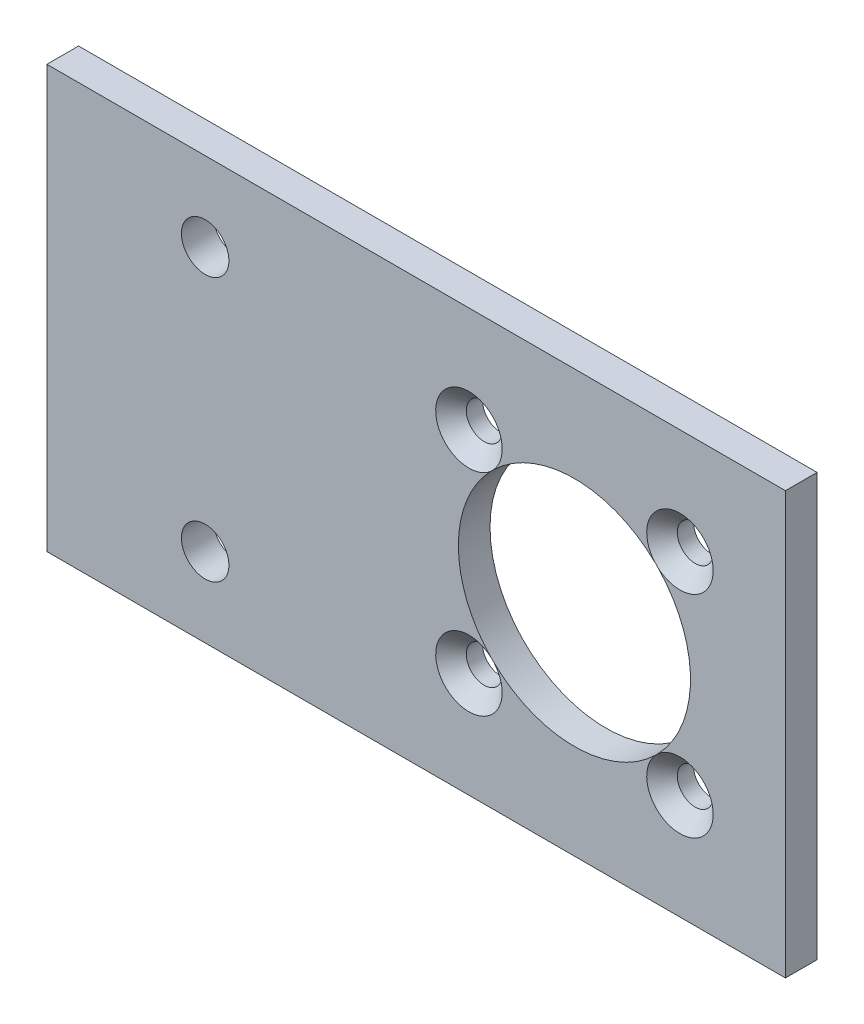
ISO-10303-21;
HEADER;
FILE_DESCRIPTION(('STEP AP214'),'2;1');
FILE_NAME('part.step','',(''),(''),'','','');
FILE_SCHEMA(('AUTOMOTIVE_DESIGN { 1 0 10303 214 1 1 1 1 }'));
ENDSEC;
DATA;
#1=APPLICATION_CONTEXT('core data for automotive mechanical design processes');
#2=APPLICATION_PROTOCOL_DEFINITION('international standard','automotive_design',2000,#1);
#3=PRODUCT_CONTEXT('',#1,'mechanical');
#4=PRODUCT('Part','Part','',(#3));
#5=PRODUCT_RELATED_PRODUCT_CATEGORY('part','',(#4));
#6=PRODUCT_DEFINITION_FORMATION('','',#4);
#7=PRODUCT_DEFINITION_CONTEXT('part definition',#1,'design');
#8=PRODUCT_DEFINITION('design','',#6,#7);
#9=PRODUCT_DEFINITION_SHAPE('','',#8);
#10=(LENGTH_UNIT() NAMED_UNIT(*) SI_UNIT(.MILLI.,.METRE.));
#11=(NAMED_UNIT(*) PLANE_ANGLE_UNIT() SI_UNIT($,.RADIAN.));
#12=(NAMED_UNIT(*) SI_UNIT($,.STERADIAN.) SOLID_ANGLE_UNIT());
#13=UNCERTAINTY_MEASURE_WITH_UNIT(LENGTH_MEASURE(1.E-05),#10,'distance_accuracy_value','');
#14=(GEOMETRIC_REPRESENTATION_CONTEXT(3) GLOBAL_UNCERTAINTY_ASSIGNED_CONTEXT((#13)) GLOBAL_UNIT_ASSIGNED_CONTEXT((#10,
#11,#12)) REPRESENTATION_CONTEXT('',''));
#15=CARTESIAN_POINT('',(0.,0.,0.));
#16=DIRECTION('',(0.,0.,1.));
#17=DIRECTION('',(1.,0.,0.));
#18=AXIS2_PLACEMENT_3D('',#15,#16,#17);
#19=CARTESIAN_POINT('',(-15.5499948658782,310.000000000003,3.));
#20=DIRECTION('',(-1.,0.,0.));
#21=DIRECTION('',(0.,0.,1.));
#22=AXIS2_PLACEMENT_3D('',#19,#20,#21);
#23=PLANE('',#22);
#24=DIRECTION('',(0.,1.,0.));
#25=VECTOR('',#24,1.);
#26=CARTESIAN_POINT('',(-15.5499948658782,310.000000000003,0.));
#27=LINE('',#26,#25);
#28=CARTESIAN_POINT('',(-15.5499948658782,310.000000000003,0.));
#29=VERTEX_POINT('',#28);
#30=CARTESIAN_POINT('',(-15.5499948658782,350.000000000003,0.));
#31=VERTEX_POINT('',#30);
#32=EDGE_CURVE('E196',#29,#31,#27,.T.);
#33=ORIENTED_EDGE('',*,*,#32,.F.);
#34=DIRECTION('',(0.,0.,-1.));
#35=VECTOR('',#34,1.);
#36=CARTESIAN_POINT('',(-15.5499948658782,310.000000000003,3.));
#37=LINE('',#36,#35);
#38=CARTESIAN_POINT('',(-15.5499948658782,310.000000000003,3.));
#39=VERTEX_POINT('',#38);
#40=EDGE_CURVE('E57',#39,#29,#37,.T.);
#41=ORIENTED_EDGE('',*,*,#40,.F.);
#42=DIRECTION('',(0.,1.,0.));
#43=VECTOR('',#42,1.);
#44=CARTESIAN_POINT('',(-15.5499948658782,310.000000000003,3.));
#45=LINE('',#44,#43);
#46=CARTESIAN_POINT('',(-15.5499948658782,350.000000000003,3.));
#47=VERTEX_POINT('',#46);
#48=EDGE_CURVE('E197',#39,#47,#45,.T.);
#49=ORIENTED_EDGE('',*,*,#48,.T.);
#50=DIRECTION('',(0.,0.,-1.));
#51=VECTOR('',#50,1.);
#52=CARTESIAN_POINT('',(-15.5499948658782,350.000000000003,3.));
#53=LINE('',#52,#51);
#54=EDGE_CURVE('E96',#47,#31,#53,.T.);
#55=ORIENTED_EDGE('',*,*,#54,.T.);
#56=EDGE_LOOP('',(#33,#41,#49,#55));
#57=FACE_BOUND('',#56,.T.);
#58=ADVANCED_FACE('F43',(#57),#23,.T.);
#59=CARTESIAN_POINT('',(-15.5499948658782,310.000000000003,3.));
#60=DIRECTION('',(0.,1.,0.));
#61=DIRECTION('',(0.,0.,1.));
#62=AXIS2_PLACEMENT_3D('',#59,#60,#61);
#63=PLANE('',#62);
#64=DIRECTION('',(1.,0.,0.));
#65=VECTOR('',#64,1.);
#66=CARTESIAN_POINT('',(-15.5499948658782,310.000000000003,0.));
#67=LINE('',#66,#65);
#68=CARTESIAN_POINT('',(54.4500051341218,310.000000000003,0.));
#69=VERTEX_POINT('',#68);
#70=EDGE_CURVE('E201',#29,#69,#67,.T.);
#71=ORIENTED_EDGE('',*,*,#70,.T.);
#72=DIRECTION('',(0.,0.,-1.));
#73=VECTOR('',#72,1.);
#74=CARTESIAN_POINT('',(54.4500051341218,310.000000000003,3.));
#75=LINE('',#74,#73);
#76=CARTESIAN_POINT('',(54.4500051341218,310.000000000003,3.));
#77=VERTEX_POINT('',#76);
#78=EDGE_CURVE('E225',#77,#69,#75,.T.);
#79=ORIENTED_EDGE('',*,*,#78,.F.);
#80=DIRECTION('',(1.,0.,0.));
#81=VECTOR('',#80,1.);
#82=CARTESIAN_POINT('',(-15.5499948658782,310.000000000003,3.));
#83=LINE('',#82,#81);
#84=EDGE_CURVE('E207',#39,#77,#83,.T.);
#85=ORIENTED_EDGE('',*,*,#84,.F.);
#86=ORIENTED_EDGE('',*,*,#40,.T.);
#87=EDGE_LOOP('',(#71,#79,#85,#86));
#88=FACE_BOUND('',#87,.T.);
#89=ADVANCED_FACE('F239',(#88),#63,.F.);
#90=CARTESIAN_POINT('',(54.4500051341218,310.000000000003,3.));
#91=DIRECTION('',(-1.,0.,0.));
#92=DIRECTION('',(0.,0.,1.));
#93=AXIS2_PLACEMENT_3D('',#90,#91,#92);
#94=PLANE('',#93);
#95=DIRECTION('',(0.,1.,0.));
#96=VECTOR('',#95,1.);
#97=CARTESIAN_POINT('',(54.4500051341218,310.000000000003,0.));
#98=LINE('',#97,#96);
#99=CARTESIAN_POINT('',(54.4500051341218,350.000000000003,0.));
#100=VERTEX_POINT('',#99);
#101=EDGE_CURVE('E217',#69,#100,#98,.T.);
#102=ORIENTED_EDGE('',*,*,#101,.T.);
#103=DIRECTION('',(0.,0.,-1.));
#104=VECTOR('',#103,1.);
#105=CARTESIAN_POINT('',(54.4500051341218,350.000000000003,3.));
#106=LINE('',#105,#104);
#107=CARTESIAN_POINT('',(54.4500051341218,350.000000000003,3.));
#108=VERTEX_POINT('',#107);
#109=EDGE_CURVE('E229',#108,#100,#106,.T.);
#110=ORIENTED_EDGE('',*,*,#109,.F.);
#111=DIRECTION('',(0.,1.,0.));
#112=VECTOR('',#111,1.);
#113=CARTESIAN_POINT('',(54.4500051341218,310.000000000003,3.));
#114=LINE('',#113,#112);
#115=EDGE_CURVE('E204',#77,#108,#114,.T.);
#116=ORIENTED_EDGE('',*,*,#115,.F.);
#117=ORIENTED_EDGE('',*,*,#78,.T.);
#118=EDGE_LOOP('',(#102,#110,#116,#117));
#119=FACE_BOUND('',#118,.T.);
#120=ADVANCED_FACE('F242',(#119),#94,.F.);
#121=CARTESIAN_POINT('',(-15.5499948658782,350.000000000003,3.));
#122=DIRECTION('',(0.,1.,0.));
#123=DIRECTION('',(0.,0.,1.));
#124=AXIS2_PLACEMENT_3D('',#121,#122,#123);
#125=PLANE('',#124);
#126=DIRECTION('',(1.,0.,0.));
#127=VECTOR('',#126,1.);
#128=CARTESIAN_POINT('',(-15.5499948658782,350.000000000003,0.));
#129=LINE('',#128,#127);
#130=EDGE_CURVE('E213',#31,#100,#129,.T.);
#131=ORIENTED_EDGE('',*,*,#130,.F.);
#132=ORIENTED_EDGE('',*,*,#54,.F.);
#133=DIRECTION('',(1.,0.,0.));
#134=VECTOR('',#133,1.);
#135=CARTESIAN_POINT('',(-15.5499948658782,350.000000000003,3.));
#136=LINE('',#135,#134);
#137=EDGE_CURVE('E200',#47,#108,#136,.T.);
#138=ORIENTED_EDGE('',*,*,#137,.T.);
#139=ORIENTED_EDGE('',*,*,#109,.T.);
#140=EDGE_LOOP('',(#131,#132,#138,#139));
#141=FACE_BOUND('',#140,.T.);
#142=ADVANCED_FACE('F233',(#141),#125,.T.);
#143=CARTESIAN_POINT('',(0.,0.,3.));
#144=DIRECTION('',(0.,0.,-1.));
#145=DIRECTION('',(-1.,0.,0.));
#146=AXIS2_PLACEMENT_3D('',#143,#144,#145);
#147=PLANE('',#146);
#148=CARTESIAN_POINT('',(-0.549994865878187,342.500000000003,3.));
#149=DIRECTION('',(0.,0.,1.));
#150=DIRECTION('',(1.,0.,0.));
#151=AXIS2_PLACEMENT_3D('',#148,#149,#150);
#152=CIRCLE('',#151,2.25);
#153=CARTESIAN_POINT('',(1.70000513412181,342.500000000003,3.));
#154=VERTEX_POINT('',#153);
#155=EDGE_CURVE('E437',#154,#154,#152,.T.);
#156=ORIENTED_EDGE('',*,*,#155,.F.);
#157=EDGE_LOOP('',(#156));
#158=FACE_BOUND('',#157,.T.);
#159=CARTESIAN_POINT('',(-0.549994865878187,317.500000000003,3.));
#160=DIRECTION('',(0.,0.,1.));
#161=DIRECTION('',(1.,0.,0.));
#162=AXIS2_PLACEMENT_3D('',#159,#160,#161);
#163=CIRCLE('',#162,2.25);
#164=CARTESIAN_POINT('',(1.70000513412181,317.500000000003,3.));
#165=VERTEX_POINT('',#164);
#166=EDGE_CURVE('E155',#165,#165,#163,.T.);
#167=ORIENTED_EDGE('',*,*,#166,.F.);
#168=EDGE_LOOP('',(#167));
#169=FACE_BOUND('',#168,.T.);
#170=CARTESIAN_POINT('',(24.4500051341218,340.000000000003,3.));
#171=DIRECTION('',(0.,0.,1.));
#172=DIRECTION('',(1.,0.,0.));
#173=AXIS2_PLACEMENT_3D('',#170,#171,#172);
#174=CIRCLE('',#173,3.15);
#175=CARTESIAN_POINT('',(26.8117872113048,337.915657077186,3.));
#176=VERTEX_POINT('',#175);
#177=CARTESIAN_POINT('',(26.5343480569389,337.63821792282,3.));
#178=VERTEX_POINT('',#177);
#179=EDGE_CURVE('E136',#176,#178,#174,.T.);
#180=ORIENTED_EDGE('',*,*,#179,.F.);
#181=CARTESIAN_POINT('',(34.4500051341218,330.000000000003,3.));
#182=DIRECTION('',(0.,0.,-1.));
#183=DIRECTION('',(-1.,0.,0.));
#184=AXIS2_PLACEMENT_3D('',#181,#182,#183);
#185=CIRCLE('',#184,11.);
#186=CARTESIAN_POINT('',(42.0882230569388,337.915657077186,3.));
#187=VERTEX_POINT('',#186);
#188=EDGE_CURVE('E124',#176,#187,#185,.T.);
#189=ORIENTED_EDGE('',*,*,#188,.T.);
#190=CARTESIAN_POINT('',(44.4500051341218,340.000000000003,3.));
#191=DIRECTION('',(0.,0.,1.));
#192=DIRECTION('',(1.,0.,0.));
#193=AXIS2_PLACEMENT_3D('',#190,#191,#192);
#194=CIRCLE('',#193,3.15);
#195=CARTESIAN_POINT('',(42.3656622113049,337.63821792282,3.));
#196=VERTEX_POINT('',#195);
#197=EDGE_CURVE('E162',#196,#187,#194,.T.);
#198=ORIENTED_EDGE('',*,*,#197,.F.);
#199=CARTESIAN_POINT('',(42.3656622113044,322.361782077186,3.));
#200=VERTEX_POINT('',#199);
#201=EDGE_CURVE('E64',#196,#200,#185,.T.);
#202=ORIENTED_EDGE('',*,*,#201,.T.);
#203=CARTESIAN_POINT('',(44.4500051341218,320.000000000003,3.));
#204=DIRECTION('',(0.,0.,1.));
#205=DIRECTION('',(1.,0.,0.));
#206=AXIS2_PLACEMENT_3D('',#203,#204,#205);
#207=CIRCLE('',#206,3.15);
#208=CARTESIAN_POINT('',(42.0882230569392,322.084342922821,3.));
#209=VERTEX_POINT('',#208);
#210=EDGE_CURVE('E174',#209,#200,#207,.T.);
#211=ORIENTED_EDGE('',*,*,#210,.F.);
#212=CARTESIAN_POINT('',(26.8117872113041,322.084342922821,3.));
#213=VERTEX_POINT('',#212);
#214=EDGE_CURVE('E141',#209,#213,#185,.T.);
#215=ORIENTED_EDGE('',*,*,#214,.T.);
#216=CARTESIAN_POINT('',(24.4500051341218,320.000000000003,3.));
#217=DIRECTION('',(0.,0.,1.));
#218=DIRECTION('',(1.,0.,0.));
#219=AXIS2_PLACEMENT_3D('',#216,#217,#218);
#220=CIRCLE('',#219,3.15);
#221=CARTESIAN_POINT('',(26.5343480569396,322.361782077186,3.));
#222=VERTEX_POINT('',#221);
#223=EDGE_CURVE('E139',#222,#213,#220,.T.);
#224=ORIENTED_EDGE('',*,*,#223,.F.);
#225=EDGE_CURVE('E121',#222,#178,#185,.T.);
#226=ORIENTED_EDGE('',*,*,#225,.T.);
#227=EDGE_LOOP('',(#180,#189,#198,#202,#211,#215,#224,#226));
#228=FACE_BOUND('',#227,.T.);
#229=ORIENTED_EDGE('',*,*,#48,.F.);
#230=ORIENTED_EDGE('',*,*,#84,.T.);
#231=ORIENTED_EDGE('',*,*,#115,.T.);
#232=ORIENTED_EDGE('',*,*,#137,.F.);
#233=EDGE_LOOP('',(#229,#230,#231,#232));
#234=FACE_BOUND('',#233,.T.);
#235=ADVANCED_FACE('F134',(#158,#169,#228,#234),#147,.F.);
#236=CARTESIAN_POINT('',(0.,0.,0.));
#237=DIRECTION('',(0.,0.,-1.));
#238=DIRECTION('',(-1.,0.,0.));
#239=AXIS2_PLACEMENT_3D('',#236,#237,#238);
#240=PLANE('',#239);
#241=CARTESIAN_POINT('',(34.4500051341218,330.000000000003,0.));
#242=DIRECTION('',(0.,0.,-1.));
#243=DIRECTION('',(-1.,0.,0.));
#244=AXIS2_PLACEMENT_3D('',#241,#242,#243);
#245=CIRCLE('',#244,11.);
#246=CARTESIAN_POINT('',(23.4500051341218,330.000000000003,0.));
#247=VERTEX_POINT('',#246);
#248=EDGE_CURVE('E142',#247,#247,#245,.T.);
#249=ORIENTED_EDGE('',*,*,#248,.F.);
#250=EDGE_LOOP('',(#249));
#251=FACE_BOUND('',#250,.T.);
#252=CARTESIAN_POINT('',(-0.549994865878187,342.500000000003,0.));
#253=DIRECTION('',(0.,0.,1.));
#254=DIRECTION('',(1.,0.,0.));
#255=AXIS2_PLACEMENT_3D('',#252,#253,#254);
#256=CIRCLE('',#255,2.25);
#257=CARTESIAN_POINT('',(1.70000513412181,342.500000000003,0.));
#258=VERTEX_POINT('',#257);
#259=EDGE_CURVE('E441',#258,#258,#256,.T.);
#260=ORIENTED_EDGE('',*,*,#259,.T.);
#261=EDGE_LOOP('',(#260));
#262=FACE_BOUND('',#261,.T.);
#263=CARTESIAN_POINT('',(-0.549994865878187,317.500000000003,0.));
#264=DIRECTION('',(0.,0.,1.));
#265=DIRECTION('',(1.,0.,0.));
#266=AXIS2_PLACEMENT_3D('',#263,#264,#265);
#267=CIRCLE('',#266,2.25);
#268=CARTESIAN_POINT('',(1.70000513412181,317.500000000003,0.));
#269=VERTEX_POINT('',#268);
#270=EDGE_CURVE('E147',#269,#269,#267,.T.);
#271=ORIENTED_EDGE('',*,*,#270,.T.);
#272=EDGE_LOOP('',(#271));
#273=FACE_BOUND('',#272,.T.);
#274=CARTESIAN_POINT('',(24.4500051341218,340.000000000003,0.));
#275=DIRECTION('',(0.,0.,1.));
#276=DIRECTION('',(1.,0.,0.));
#277=AXIS2_PLACEMENT_3D('',#274,#275,#276);
#278=CIRCLE('',#277,1.7);
#279=CARTESIAN_POINT('',(26.1500051341218,340.000000000003,0.));
#280=VERTEX_POINT('',#279);
#281=EDGE_CURVE('E152',#280,#280,#278,.T.);
#282=ORIENTED_EDGE('',*,*,#281,.T.);
#283=EDGE_LOOP('',(#282));
#284=FACE_BOUND('',#283,.T.);
#285=CARTESIAN_POINT('',(44.4500051341218,340.000000000003,0.));
#286=DIRECTION('',(0.,0.,1.));
#287=DIRECTION('',(1.,0.,0.));
#288=AXIS2_PLACEMENT_3D('',#285,#286,#287);
#289=CIRCLE('',#288,1.7);
#290=CARTESIAN_POINT('',(46.1500051341218,340.000000000003,0.));
#291=VERTEX_POINT('',#290);
#292=EDGE_CURVE('E170',#291,#291,#289,.T.);
#293=ORIENTED_EDGE('',*,*,#292,.T.);
#294=EDGE_LOOP('',(#293));
#295=FACE_BOUND('',#294,.T.);
#296=CARTESIAN_POINT('',(44.4500051341218,320.000000000003,0.));
#297=DIRECTION('',(0.,0.,1.));
#298=DIRECTION('',(1.,0.,0.));
#299=AXIS2_PLACEMENT_3D('',#296,#297,#298);
#300=CIRCLE('',#299,1.7);
#301=CARTESIAN_POINT('',(46.1500051341218,320.000000000003,0.));
#302=VERTEX_POINT('',#301);
#303=EDGE_CURVE('E182',#302,#302,#300,.T.);
#304=ORIENTED_EDGE('',*,*,#303,.T.);
#305=EDGE_LOOP('',(#304));
#306=FACE_BOUND('',#305,.T.);
#307=CARTESIAN_POINT('',(24.4500051341218,320.000000000003,0.));
#308=DIRECTION('',(0.,0.,1.));
#309=DIRECTION('',(1.,0.,0.));
#310=AXIS2_PLACEMENT_3D('',#307,#308,#309);
#311=CIRCLE('',#310,1.7);
#312=CARTESIAN_POINT('',(26.1500051341218,320.000000000003,0.));
#313=VERTEX_POINT('',#312);
#314=EDGE_CURVE('E192',#313,#313,#311,.T.);
#315=ORIENTED_EDGE('',*,*,#314,.T.);
#316=EDGE_LOOP('',(#315));
#317=FACE_BOUND('',#316,.T.);
#318=ORIENTED_EDGE('',*,*,#32,.T.);
#319=ORIENTED_EDGE('',*,*,#130,.T.);
#320=ORIENTED_EDGE('',*,*,#101,.F.);
#321=ORIENTED_EDGE('',*,*,#70,.F.);
#322=EDGE_LOOP('',(#318,#319,#320,#321));
#323=FACE_BOUND('',#322,.T.);
#324=ADVANCED_FACE('F237',(#251,#262,#273,#284,#295,#306,#317,#323),#240,.T.);
#325=CARTESIAN_POINT('',(24.4500051341218,320.000000000003,3.));
#326=DIRECTION('',(0.,0.,1.));
#327=DIRECTION('',(1.,0.,0.));
#328=AXIS2_PLACEMENT_3D('',#325,#326,#327);
#329=CYLINDRICAL_SURFACE('',#328,1.7);
#330=ORIENTED_EDGE('',*,*,#314,.F.);
#331=EDGE_LOOP('',(#330));
#332=FACE_BOUND('',#331,.T.);
#333=CARTESIAN_POINT('',(24.4500051341218,320.000000000003,1.55));
#334=DIRECTION('',(0.,0.,1.));
#335=DIRECTION('',(1.,0.,0.));
#336=AXIS2_PLACEMENT_3D('',#333,#334,#335);
#337=CIRCLE('',#336,1.7);
#338=CARTESIAN_POINT('',(26.1500051341218,320.000000000003,1.55));
#339=VERTEX_POINT('',#338);
#340=EDGE_CURVE('E188',#339,#339,#337,.T.);
#341=ORIENTED_EDGE('',*,*,#340,.T.);
#342=EDGE_LOOP('',(#341));
#343=FACE_BOUND('',#342,.T.);
#344=ADVANCED_FACE('F250',(#332,#343),#329,.F.);
#345=CARTESIAN_POINT('',(24.4500051341218,320.000000000003,3.));
#346=DIRECTION('',(0.,0.,1.));
#347=DIRECTION('',(1.,0.,0.));
#348=AXIS2_PLACEMENT_3D('',#345,#346,#347);
#349=CONICAL_SURFACE('',#348,3.15,0.785398163397448);
#350=ORIENTED_EDGE('',*,*,#340,.F.);
#351=EDGE_LOOP('',(#350));
#352=FACE_BOUND('',#351,.T.);
#353=ORIENTED_EDGE('',*,*,#223,.T.);
#354=CARTESIAN_POINT('',(26.8135736264634,322.082619509662,3.0002));
#355=CARTESIAN_POINT('',(26.7659030666482,322.128598610741,2.994823749154));
#356=CARTESIAN_POINT('',(26.718655371517,322.175000576504,2.992135623731));
#357=CARTESIAN_POINT('',(26.6250057106226,322.268650237399,2.992135623731));
#358=CARTESIAN_POINT('',(26.5786037448594,322.31589793253,2.994823749154));
#359=CARTESIAN_POINT('',(26.5326246437802,322.363568492345,3.0002));
#360=B_SPLINE_CURVE_WITH_KNOTS('',3,(#354,#355,#356,#357,#358,#359),.UNSPECIFIED.,.F.,.F.,(4,2,
4),(0.,0.198832638823961,0.397665277648004),.UNSPECIFIED.);
#361=EDGE_CURVE('E130',#213,#222,#360,.T.);
#362=ORIENTED_EDGE('',*,*,#361,.T.);
#363=EDGE_LOOP('',(#353,#362));
#364=FACE_BOUND('',#363,.T.);
#365=ADVANCED_FACE('F281',(#352,#364),#349,.F.);
#366=CARTESIAN_POINT('',(44.4500051341218,320.000000000003,3.));
#367=DIRECTION('',(0.,0.,1.));
#368=DIRECTION('',(1.,0.,0.));
#369=AXIS2_PLACEMENT_3D('',#366,#367,#368);
#370=CYLINDRICAL_SURFACE('',#369,1.7);
#371=ORIENTED_EDGE('',*,*,#303,.F.);
#372=EDGE_LOOP('',(#371));
#373=FACE_BOUND('',#372,.T.);
#374=CARTESIAN_POINT('',(44.4500051341218,320.000000000003,1.55));
#375=DIRECTION('',(0.,0.,1.));
#376=DIRECTION('',(1.,0.,0.));
#377=AXIS2_PLACEMENT_3D('',#374,#375,#376);
#378=CIRCLE('',#377,1.7);
#379=CARTESIAN_POINT('',(46.1500051341218,320.000000000003,1.55));
#380=VERTEX_POINT('',#379);
#381=EDGE_CURVE('E178',#380,#380,#378,.T.);
#382=ORIENTED_EDGE('',*,*,#381,.T.);
#383=EDGE_LOOP('',(#382));
#384=FACE_BOUND('',#383,.T.);
#385=ADVANCED_FACE('F290',(#373,#384),#370,.F.);
#386=CARTESIAN_POINT('',(44.4500051341218,320.000000000003,3.));
#387=DIRECTION('',(0.,0.,1.));
#388=DIRECTION('',(1.,0.,0.));
#389=AXIS2_PLACEMENT_3D('',#386,#387,#388);
#390=CONICAL_SURFACE('',#389,3.15,0.785398163397448);
#391=ORIENTED_EDGE('',*,*,#381,.F.);
#392=EDGE_LOOP('',(#391));
#393=FACE_BOUND('',#392,.T.);
#394=ORIENTED_EDGE('',*,*,#210,.T.);
#395=CARTESIAN_POINT('',(42.3673856244638,322.363568492345,3.0002));
#396=CARTESIAN_POINT('',(42.3214065233845,322.31589793253,2.99482374915397));
#397=CARTESIAN_POINT('',(42.2750045576212,322.268650237399,2.99213562373096));
#398=CARTESIAN_POINT('',(42.1813548967265,322.175000576504,2.99213562373096));
#399=CARTESIAN_POINT('',(42.1341072015952,322.128598610741,2.99482374915397));
#400=CARTESIAN_POINT('',(42.0864366417798,322.082619509661,3.0002));
#401=B_SPLINE_CURVE_WITH_KNOTS('',3,(#395,#396,#397,#398,#399,#400),.UNSPECIFIED.,.F.,.F.,(4,2,
4),(0.,0.198832638824584,0.397665277649157),.UNSPECIFIED.);
#402=EDGE_CURVE('E129',#200,#209,#401,.T.);
#403=ORIENTED_EDGE('',*,*,#402,.T.);
#404=EDGE_LOOP('',(#394,#403));
#405=FACE_BOUND('',#404,.T.);
#406=ADVANCED_FACE('F295',(#393,#405),#390,.F.);
#407=CARTESIAN_POINT('',(44.4500051341218,340.000000000003,3.));
#408=DIRECTION('',(0.,0.,1.));
#409=DIRECTION('',(1.,0.,0.));
#410=AXIS2_PLACEMENT_3D('',#407,#408,#409);
#411=CYLINDRICAL_SURFACE('',#410,1.7);
#412=ORIENTED_EDGE('',*,*,#292,.F.);
#413=EDGE_LOOP('',(#412));
#414=FACE_BOUND('',#413,.T.);
#415=CARTESIAN_POINT('',(44.4500051341218,340.000000000003,1.55));
#416=DIRECTION('',(0.,0.,1.));
#417=DIRECTION('',(1.,0.,0.));
#418=AXIS2_PLACEMENT_3D('',#415,#416,#417);
#419=CIRCLE('',#418,1.7);
#420=CARTESIAN_POINT('',(46.1500051341218,340.000000000003,1.55));
#421=VERTEX_POINT('',#420);
#422=EDGE_CURVE('E166',#421,#421,#419,.T.);
#423=ORIENTED_EDGE('',*,*,#422,.T.);
#424=EDGE_LOOP('',(#423));
#425=FACE_BOUND('',#424,.T.);
#426=ADVANCED_FACE('F304',(#414,#425),#411,.F.);
#427=CARTESIAN_POINT('',(44.4500051341218,340.000000000003,3.));
#428=DIRECTION('',(0.,0.,1.));
#429=DIRECTION('',(1.,0.,0.));
#430=AXIS2_PLACEMENT_3D('',#427,#428,#429);
#431=CONICAL_SURFACE('',#430,3.15,0.785398163397448);
#432=ORIENTED_EDGE('',*,*,#422,.F.);
#433=EDGE_LOOP('',(#432));
#434=FACE_BOUND('',#433,.T.);
#435=ORIENTED_EDGE('',*,*,#197,.T.);
#436=CARTESIAN_POINT('',(42.0864366417795,337.917380490346,3.0002));
#437=CARTESIAN_POINT('',(42.134107201595,337.871401389266,2.99482374915394));
#438=CARTESIAN_POINT('',(42.1813548967264,337.824999423503,2.99213562373092));
#439=CARTESIAN_POINT('',(42.2750045576213,337.731349762608,2.99213562373092));
#440=CARTESIAN_POINT('',(42.3214065233848,337.684102067476,2.99482374915395));
#441=CARTESIAN_POINT('',(42.3673856244642,337.636431507661,3.0002));
#442=B_SPLINE_CURVE_WITH_KNOTS('',3,(#436,#437,#438,#439,#440,#441),.UNSPECIFIED.,.F.,.F.,(4,2,
4),(0.,0.198832638825056,0.397665277650052),.UNSPECIFIED.);
#443=EDGE_CURVE('E11',#187,#196,#442,.T.);
#444=ORIENTED_EDGE('',*,*,#443,.T.);
#445=EDGE_LOOP('',(#435,#444));
#446=FACE_BOUND('',#445,.T.);
#447=ADVANCED_FACE('F309',(#434,#446),#431,.F.);
#448=CARTESIAN_POINT('',(24.4500051341218,340.000000000003,3.));
#449=DIRECTION('',(0.,0.,1.));
#450=DIRECTION('',(1.,0.,0.));
#451=AXIS2_PLACEMENT_3D('',#448,#449,#450);
#452=CYLINDRICAL_SURFACE('',#451,1.7);
#453=ORIENTED_EDGE('',*,*,#281,.F.);
#454=EDGE_LOOP('',(#453));
#455=FACE_BOUND('',#454,.T.);
#456=CARTESIAN_POINT('',(24.4500051341218,340.000000000003,1.55));
#457=DIRECTION('',(0.,0.,1.));
#458=DIRECTION('',(1.,0.,0.));
#459=AXIS2_PLACEMENT_3D('',#456,#457,#458);
#460=CIRCLE('',#459,1.7);
#461=CARTESIAN_POINT('',(26.1500051341218,340.000000000003,1.55));
#462=VERTEX_POINT('',#461);
#463=EDGE_CURVE('E146',#462,#462,#460,.T.);
#464=ORIENTED_EDGE('',*,*,#463,.T.);
#465=EDGE_LOOP('',(#464));
#466=FACE_BOUND('',#465,.T.);
#467=ADVANCED_FACE('F318',(#455,#466),#452,.F.);
#468=CARTESIAN_POINT('',(24.4500051341218,340.000000000003,3.));
#469=DIRECTION('',(0.,0.,1.));
#470=DIRECTION('',(1.,0.,0.));
#471=AXIS2_PLACEMENT_3D('',#468,#469,#470);
#472=CONICAL_SURFACE('',#471,3.15,0.785398163397448);
#473=ORIENTED_EDGE('',*,*,#463,.F.);
#474=EDGE_LOOP('',(#473));
#475=FACE_BOUND('',#474,.T.);
#476=ORIENTED_EDGE('',*,*,#179,.T.);
#477=CARTESIAN_POINT('',(26.5326246437795,337.636431507661,3.0002));
#478=CARTESIAN_POINT('',(26.5786037448589,337.684102067476,2.99482374915395));
#479=CARTESIAN_POINT('',(26.6250057106223,337.731349762608,2.99213562373092));
#480=CARTESIAN_POINT('',(26.7186553715172,337.824999423503,2.99213562373092));
#481=CARTESIAN_POINT('',(26.7659030666486,337.871401389266,2.99482374915394));
#482=CARTESIAN_POINT('',(26.8135736264641,337.917380490346,3.00019999999999));
#483=B_SPLINE_CURVE_WITH_KNOTS('',3,(#477,#478,#479,#480,#481,#482),.UNSPECIFIED.,.F.,.F.,(4,2,
4),(0.,0.198832638824913,0.397665277649877),.UNSPECIFIED.);
#484=EDGE_CURVE('E118',#178,#176,#483,.T.);
#485=ORIENTED_EDGE('',*,*,#484,.T.);
#486=EDGE_LOOP('',(#476,#485));
#487=FACE_BOUND('',#486,.T.);
#488=ADVANCED_FACE('F144',(#475,#487),#472,.F.);
#489=CARTESIAN_POINT('',(-0.549994865878187,317.500000000003,3.));
#490=DIRECTION('',(0.,0.,1.));
#491=DIRECTION('',(1.,0.,0.));
#492=AXIS2_PLACEMENT_3D('',#489,#490,#491);
#493=CYLINDRICAL_SURFACE('',#492,2.25);
#494=ORIENTED_EDGE('',*,*,#270,.F.);
#495=EDGE_LOOP('',(#494));
#496=FACE_BOUND('',#495,.T.);
#497=ORIENTED_EDGE('',*,*,#166,.T.);
#498=EDGE_LOOP('',(#497));
#499=FACE_BOUND('',#498,.T.);
#500=ADVANCED_FACE('F331',(#496,#499),#493,.F.);
#501=CARTESIAN_POINT('',(-0.549994865878187,342.500000000003,3.));
#502=DIRECTION('',(0.,0.,1.));
#503=DIRECTION('',(1.,0.,0.));
#504=AXIS2_PLACEMENT_3D('',#501,#502,#503);
#505=CYLINDRICAL_SURFACE('',#504,2.25);
#506=ORIENTED_EDGE('',*,*,#259,.F.);
#507=EDGE_LOOP('',(#506));
#508=FACE_BOUND('',#507,.T.);
#509=ORIENTED_EDGE('',*,*,#155,.T.);
#510=EDGE_LOOP('',(#509));
#511=FACE_BOUND('',#510,.T.);
#512=ADVANCED_FACE('F336',(#508,#511),#505,.F.);
#513=CARTESIAN_POINT('',(34.4500051341218,330.000000000003,0.));
#514=DIRECTION('',(0.,0.,-1.));
#515=DIRECTION('',(-1.,0.,0.));
#516=AXIS2_PLACEMENT_3D('',#513,#514,#515);
#517=CYLINDRICAL_SURFACE('',#516,11.);
#518=ORIENTED_EDGE('',*,*,#248,.T.);
#519=EDGE_LOOP('',(#518));
#520=FACE_BOUND('',#519,.T.);
#521=ORIENTED_EDGE('',*,*,#201,.F.);
#522=ORIENTED_EDGE('',*,*,#443,.F.);
#523=ORIENTED_EDGE('',*,*,#188,.F.);
#524=ORIENTED_EDGE('',*,*,#484,.F.);
#525=ORIENTED_EDGE('',*,*,#225,.F.);
#526=ORIENTED_EDGE('',*,*,#361,.F.);
#527=ORIENTED_EDGE('',*,*,#214,.F.);
#528=ORIENTED_EDGE('',*,*,#402,.F.);
#529=EDGE_LOOP('',(#521,#522,#523,#524,#525,#526,#527,#528));
#530=FACE_BOUND('',#529,.T.);
#531=ADVANCED_FACE('F120',(#520,#530),#517,.F.);
#532=CLOSED_SHELL('',(#58,#89,#120,#142,#235,#324,#344,#365,#385,#406,#426,#447,#467,#488,#500,
#512,#531));
#533=MANIFOLD_SOLID_BREP('B2',#532);
#534=ADVANCED_BREP_SHAPE_REPRESENTATION('',(#18,#533),#14);
#535=SHAPE_DEFINITION_REPRESENTATION(#9,#534);
ENDSEC;
END-ISO-10303-21;
